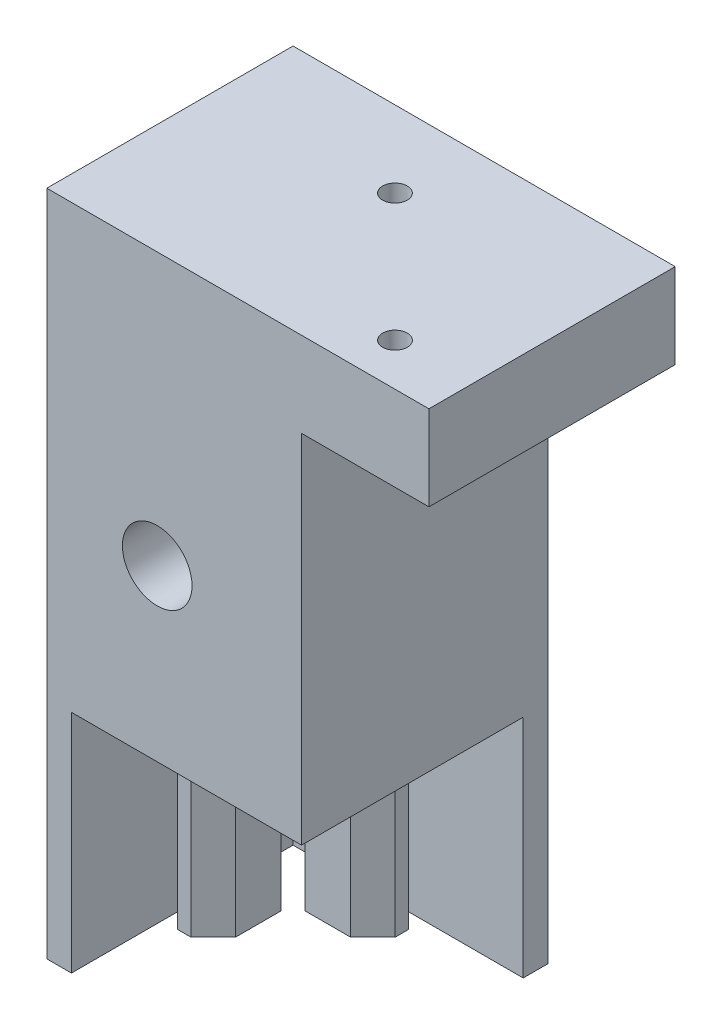
ISO-10303-21;
HEADER;
FILE_DESCRIPTION(('STEP AP214'),'2;1');
FILE_NAME('part.step','',(''),(''),'','','');
FILE_SCHEMA(('AUTOMOTIVE_DESIGN { 1 0 10303 214 1 1 1 1 }'));
ENDSEC;
DATA;
#1=APPLICATION_CONTEXT('core data for automotive mechanical design processes');
#2=APPLICATION_PROTOCOL_DEFINITION('international standard','automotive_design',2000,#1);
#3=PRODUCT_CONTEXT('',#1,'mechanical');
#4=PRODUCT('Part','Part','',(#3));
#5=PRODUCT_RELATED_PRODUCT_CATEGORY('part','',(#4));
#6=PRODUCT_DEFINITION_FORMATION('','',#4);
#7=PRODUCT_DEFINITION_CONTEXT('part definition',#1,'design');
#8=PRODUCT_DEFINITION('design','',#6,#7);
#9=PRODUCT_DEFINITION_SHAPE('','',#8);
#10=(LENGTH_UNIT() NAMED_UNIT(*) SI_UNIT(.MILLI.,.METRE.));
#11=(NAMED_UNIT(*) PLANE_ANGLE_UNIT() SI_UNIT($,.RADIAN.));
#12=(NAMED_UNIT(*) SI_UNIT($,.STERADIAN.) SOLID_ANGLE_UNIT());
#13=UNCERTAINTY_MEASURE_WITH_UNIT(LENGTH_MEASURE(1.E-05),#10,'distance_accuracy_value','');
#14=(GEOMETRIC_REPRESENTATION_CONTEXT(3) GLOBAL_UNCERTAINTY_ASSIGNED_CONTEXT((#13)) GLOBAL_UNIT_ASSIGNED_CONTEXT((#10,
#11,#12)) REPRESENTATION_CONTEXT('',''));
#15=CARTESIAN_POINT('',(0.,0.,0.));
#16=DIRECTION('',(0.,0.,1.));
#17=DIRECTION('',(1.,0.,0.));
#18=AXIS2_PLACEMENT_3D('',#15,#16,#17);
#19=CARTESIAN_POINT('',(0.,0.,6.));
#20=DIRECTION('',(0.,0.,1.));
#21=DIRECTION('',(1.,0.,0.));
#22=AXIS2_PLACEMENT_3D('',#19,#20,#21);
#23=PLANE('',#22);
#24=CARTESIAN_POINT('',(13.,40.,6.));
#25=DIRECTION('',(0.,0.,1.));
#26=DIRECTION('',(1.,0.,0.));
#27=AXIS2_PLACEMENT_3D('',#24,#25,#26);
#28=CIRCLE('',#27,4.1);
#29=CARTESIAN_POINT('',(17.1,40.,6.));
#30=VERTEX_POINT('',#29);
#31=EDGE_CURVE('E387',#30,#30,#28,.T.);
#32=ORIENTED_EDGE('',*,*,#31,.F.);
#33=EDGE_LOOP('',(#32));
#34=FACE_BOUND('',#33,.T.);
#35=DIRECTION('',(0.,-1.,0.));
#36=VECTOR('',#35,1.);
#37=CARTESIAN_POINT('',(0.,72.,6.));
#38=LINE('',#37,#36);
#39=CARTESIAN_POINT('',(0.,72.,6.));
#40=VERTEX_POINT('',#39);
#41=CARTESIAN_POINT('',(0.,-6.6,6.));
#42=VERTEX_POINT('',#41);
#43=EDGE_CURVE('E395',#40,#42,#38,.T.);
#44=ORIENTED_EDGE('',*,*,#43,.T.);
#45=DIRECTION('',(-1.,0.,0.));
#46=VECTOR('',#45,1.);
#47=CARTESIAN_POINT('',(2.9,-6.6,6.));
#48=LINE('',#47,#46);
#49=CARTESIAN_POINT('',(2.9,-6.6,6.));
#50=VERTEX_POINT('',#49);
#51=EDGE_CURVE('E290',#50,#42,#48,.T.);
#52=ORIENTED_EDGE('',*,*,#51,.F.);
#53=DIRECTION('',(0.,-1.,0.));
#54=VECTOR('',#53,1.);
#55=CARTESIAN_POINT('',(2.9,34.1003546051186,6.));
#56=LINE('',#55,#54);
#57=CARTESIAN_POINT('',(2.9,20.,6.));
#58=VERTEX_POINT('',#57);
#59=EDGE_CURVE('E361',#58,#50,#56,.T.);
#60=ORIENTED_EDGE('',*,*,#59,.F.);
#61=DIRECTION('',(1.,0.,0.));
#62=VECTOR('',#61,1.);
#63=CARTESIAN_POINT('',(3.,20.,6.));
#64=LINE('',#63,#62);
#65=CARTESIAN_POINT('',(30.,20.,6.));
#66=VERTEX_POINT('',#65);
#67=EDGE_CURVE('E397',#58,#66,#64,.T.);
#68=ORIENTED_EDGE('',*,*,#67,.T.);
#69=DIRECTION('',(0.,1.,0.));
#70=VECTOR('',#69,1.);
#71=CARTESIAN_POINT('',(30.,20.,6.));
#72=LINE('',#71,#70);
#73=CARTESIAN_POINT('',(30.,62.,6.));
#74=VERTEX_POINT('',#73);
#75=EDGE_CURVE('E400',#66,#74,#72,.T.);
#76=ORIENTED_EDGE('',*,*,#75,.T.);
#77=DIRECTION('',(1.,0.,0.));
#78=VECTOR('',#77,1.);
#79=CARTESIAN_POINT('',(30.,62.,6.));
#80=LINE('',#79,#78);
#81=CARTESIAN_POINT('',(45.0000000000006,62.,6.));
#82=VERTEX_POINT('',#81);
#83=EDGE_CURVE('E403',#74,#82,#80,.T.);
#84=ORIENTED_EDGE('',*,*,#83,.T.);
#85=DIRECTION('',(0.,1.,0.));
#86=VECTOR('',#85,1.);
#87=CARTESIAN_POINT('',(45.0000000000006,62.,6.));
#88=LINE('',#87,#86);
#89=CARTESIAN_POINT('',(45.0000000000006,72.,6.));
#90=VERTEX_POINT('',#89);
#91=EDGE_CURVE('E406',#82,#90,#88,.T.);
#92=ORIENTED_EDGE('',*,*,#91,.T.);
#93=DIRECTION('',(-1.,0.,0.));
#94=VECTOR('',#93,1.);
#95=CARTESIAN_POINT('',(45.0000000000006,72.,6.));
#96=LINE('',#95,#94);
#97=EDGE_CURVE('E409',#90,#40,#96,.T.);
#98=ORIENTED_EDGE('',*,*,#97,.T.);
#99=EDGE_LOOP('',(#44,#52,#60,#68,#76,#84,#92,#98));
#100=FACE_BOUND('',#99,.T.);
#101=ADVANCED_FACE('F71',(#34,#100),#23,.T.);
#102=CARTESIAN_POINT('',(13.,40.,-6.));
#103=DIRECTION('',(0.,0.,1.));
#104=DIRECTION('',(1.,0.,0.));
#105=AXIS2_PLACEMENT_3D('',#102,#103,#104);
#106=CYLINDRICAL_SURFACE('',#105,4.1);
#107=CARTESIAN_POINT('',(13.,40.,-6.));
#108=DIRECTION('',(0.,0.,1.));
#109=DIRECTION('',(1.,0.,0.));
#110=AXIS2_PLACEMENT_3D('',#107,#108,#109);
#111=CIRCLE('',#110,4.1);
#112=CARTESIAN_POINT('',(17.1,40.,-6.));
#113=VERTEX_POINT('',#112);
#114=EDGE_CURVE('E502',#113,#113,#111,.T.);
#115=ORIENTED_EDGE('',*,*,#114,.F.);
#116=EDGE_LOOP('',(#115));
#117=FACE_BOUND('',#116,.T.);
#118=ORIENTED_EDGE('',*,*,#31,.T.);
#119=EDGE_LOOP('',(#118));
#120=FACE_BOUND('',#119,.T.);
#121=ADVANCED_FACE('F623',(#117,#120),#106,.F.);
#122=CARTESIAN_POINT('',(13.,40.,-6.));
#123=DIRECTION('',(0.,0.,1.));
#124=DIRECTION('',(1.,0.,0.));
#125=AXIS2_PLACEMENT_3D('',#122,#123,#124);
#126=PLANE('',#125);
#127=ORIENTED_EDGE('',*,*,#114,.T.);
#128=EDGE_LOOP('',(#127));
#129=FACE_BOUND('',#128,.T.);
#130=ADVANCED_FACE('F629',(#129),#126,.T.);
#131=CARTESIAN_POINT('',(23.,-12.1313643090702,-15.2999999996485));
#132=DIRECTION('',(0.,0.,-1.));
#133=DIRECTION('',(-1.,0.,0.));
#134=AXIS2_PLACEMENT_3D('',#131,#132,#133);
#135=PLANE('',#134);
#136=DIRECTION('',(0.,1.,0.));
#137=VECTOR('',#136,1.);
#138=CARTESIAN_POINT('',(6.26715728747304,-12.1313643090702,-15.2999999996485));
#139=LINE('',#138,#137);
#140=CARTESIAN_POINT('',(6.26715728747304,-6.6,-15.2999999996485));
#141=VERTEX_POINT('',#140);
#142=CARTESIAN_POINT('',(6.26715728747304,20.,-15.2999999996485));
#143=VERTEX_POINT('',#142);
#144=EDGE_CURVE('E437',#141,#143,#139,.T.);
#145=ORIENTED_EDGE('',*,*,#144,.F.);
#146=DIRECTION('',(1.,0.,0.));
#147=VECTOR('',#146,1.);
#148=CARTESIAN_POINT('',(4.69999999994772,-6.6,-15.2999999996485));
#149=LINE('',#148,#147);
#150=CARTESIAN_POINT('',(4.69999999994772,-6.6,-15.2999999996485));
#151=VERTEX_POINT('',#150);
#152=EDGE_CURVE('E344',#151,#141,#149,.T.);
#153=ORIENTED_EDGE('',*,*,#152,.F.);
#154=DIRECTION('',(0.,1.,0.));
#155=VECTOR('',#154,1.);
#156=CARTESIAN_POINT('',(4.69999999994772,-12.1313643090702,-15.2999999996485));
#157=LINE('',#156,#155);
#158=CARTESIAN_POINT('',(4.69999999994772,20.,-15.2999999996485));
#159=VERTEX_POINT('',#158);
#160=EDGE_CURVE('E434',#151,#159,#157,.T.);
#161=ORIENTED_EDGE('',*,*,#160,.T.);
#162=DIRECTION('',(-1.,0.,0.));
#163=VECTOR('',#162,1.);
#164=CARTESIAN_POINT('',(23.,20.,-15.2999999996485));
#165=LINE('',#164,#163);
#166=EDGE_CURVE('E270',#143,#159,#165,.T.);
#167=ORIENTED_EDGE('',*,*,#166,.F.);
#168=EDGE_LOOP('',(#145,#153,#161,#167));
#169=FACE_BOUND('',#168,.T.);
#170=ADVANCED_FACE('F598',(#169),#135,.T.);
#171=CARTESIAN_POINT('',(10.7835786435609,-12.1313643090702,-10.7835786435608));
#172=DIRECTION('',(0.707106781186544,0.,-0.707106781186551));
#173=DIRECTION('',(-0.707106781186551,0.,-0.707106781186544));
#174=AXIS2_PLACEMENT_3D('',#171,#172,#173);
#175=PLANE('',#174);
#176=DIRECTION('',(0.,1.,0.));
#177=VECTOR('',#176,1.);
#178=CARTESIAN_POINT('',(8.8999999999477,-12.1313643090702,-12.6671572871739));
#179=LINE('',#178,#177);
#180=CARTESIAN_POINT('',(8.8999999999477,-6.6,-12.6671572871739));
#181=VERTEX_POINT('',#180);
#182=CARTESIAN_POINT('',(8.8999999999477,20.,-12.6671572871739));
#183=VERTEX_POINT('',#182);
#184=EDGE_CURVE('E439',#181,#183,#179,.T.);
#185=ORIENTED_EDGE('',*,*,#184,.F.);
#186=DIRECTION('',(0.70710678118655,0.,0.707106781186545));
#187=VECTOR('',#186,1.);
#188=CARTESIAN_POINT('',(6.26715728747304,-6.6,-15.2999999996485));
#189=LINE('',#188,#187);
#190=EDGE_CURVE('E347',#141,#181,#189,.T.);
#191=ORIENTED_EDGE('',*,*,#190,.F.);
#192=ORIENTED_EDGE('',*,*,#144,.T.);
#193=DIRECTION('',(-0.707106781186551,0.,-0.707106781186544));
#194=VECTOR('',#193,1.);
#195=CARTESIAN_POINT('',(10.7835786435609,20.,-10.7835786435608));
#196=LINE('',#195,#194);
#197=EDGE_CURVE('E427',#183,#143,#196,.T.);
#198=ORIENTED_EDGE('',*,*,#197,.F.);
#199=EDGE_LOOP('',(#185,#191,#192,#198));
#200=FACE_BOUND('',#199,.T.);
#201=ADVANCED_FACE('F602',(#200),#175,.T.);
#202=CARTESIAN_POINT('',(8.8999999999477,-12.1313643090702,-23.));
#203=DIRECTION('',(1.,0.,0.));
#204=DIRECTION('',(0.,0.,-1.));
#205=AXIS2_PLACEMENT_3D('',#202,#203,#204);
#206=PLANE('',#205);
#207=DIRECTION('',(0.,1.,0.));
#208=VECTOR('',#207,1.);
#209=CARTESIAN_POINT('',(8.8999999999477,-12.1313643090702,-7.33284271212317));
#210=LINE('',#209,#208);
#211=CARTESIAN_POINT('',(8.8999999999477,-6.6,-7.33284271212316));
#212=VERTEX_POINT('',#211);
#213=CARTESIAN_POINT('',(8.8999999999477,20.,-7.33284271212317));
#214=VERTEX_POINT('',#213);
#215=EDGE_CURVE('E441',#212,#214,#210,.T.);
#216=ORIENTED_EDGE('',*,*,#215,.F.);
#217=DIRECTION('',(0.,0.,1.));
#218=VECTOR('',#217,1.);
#219=CARTESIAN_POINT('',(8.8999999999477,-6.6,-12.6671572871739));
#220=LINE('',#219,#218);
#221=EDGE_CURVE('E350',#181,#212,#220,.T.);
#222=ORIENTED_EDGE('',*,*,#221,.F.);
#223=ORIENTED_EDGE('',*,*,#184,.T.);
#224=DIRECTION('',(0.,0.,-1.));
#225=VECTOR('',#224,1.);
#226=CARTESIAN_POINT('',(8.8999999999477,20.,-23.));
#227=LINE('',#226,#225);
#228=EDGE_CURVE('E424',#214,#183,#227,.T.);
#229=ORIENTED_EDGE('',*,*,#228,.F.);
#230=EDGE_LOOP('',(#216,#222,#223,#229));
#231=FACE_BOUND('',#230,.T.);
#232=ADVANCED_FACE('F606',(#231),#206,.T.);
#233=CARTESIAN_POINT('',(23.7835786439122,-12.1313643090702,-22.2164213560878));
#234=DIRECTION('',(0.707106781186551,0.,0.707106781186544));
#235=DIRECTION('',(0.707106781186544,0.,-0.707106781186551));
#236=AXIS2_PLACEMENT_3D('',#233,#234,#235);
#237=PLANE('',#236);
#238=DIRECTION('',(0.,1.,0.));
#239=VECTOR('',#238,1.);
#240=CARTESIAN_POINT('',(6.26715728747308,-12.1313643090702,-4.69999999964852));
#241=LINE('',#240,#239);
#242=CARTESIAN_POINT('',(6.26715728747308,-6.6,-4.69999999964852));
#243=VERTEX_POINT('',#242);
#244=CARTESIAN_POINT('',(6.26715728747308,20.,-4.69999999964852));
#245=VERTEX_POINT('',#244);
#246=EDGE_CURVE('E443',#243,#245,#241,.T.);
#247=ORIENTED_EDGE('',*,*,#246,.F.);
#248=DIRECTION('',(-0.707106781186545,0.,0.70710678118655));
#249=VECTOR('',#248,1.);
#250=CARTESIAN_POINT('',(8.8999999999477,-6.6,-7.33284271212316));
#251=LINE('',#250,#249);
#252=EDGE_CURVE('E353',#212,#243,#251,.T.);
#253=ORIENTED_EDGE('',*,*,#252,.F.);
#254=ORIENTED_EDGE('',*,*,#215,.T.);
#255=DIRECTION('',(0.707106781186545,0.,-0.707106781186551));
#256=VECTOR('',#255,1.);
#257=CARTESIAN_POINT('',(23.7835786439122,20.,-22.2164213560878));
#258=LINE('',#257,#256);
#259=EDGE_CURVE('E421',#245,#214,#258,.T.);
#260=ORIENTED_EDGE('',*,*,#259,.F.);
#261=EDGE_LOOP('',(#247,#253,#254,#260));
#262=FACE_BOUND('',#261,.T.);
#263=ADVANCED_FACE('F609',(#262),#237,.T.);
#264=CARTESIAN_POINT('',(23.,-12.1313643090702,-4.69999999964853));
#265=DIRECTION('',(0.,0.,1.));
#266=DIRECTION('',(1.,0.,0.));
#267=AXIS2_PLACEMENT_3D('',#264,#265,#266);
#268=PLANE('',#267);
#269=DIRECTION('',(0.,1.,0.));
#270=VECTOR('',#269,1.);
#271=CARTESIAN_POINT('',(4.69999999994772,-12.1313643090702,-4.69999999964852));
#272=LINE('',#271,#270);
#273=CARTESIAN_POINT('',(4.69999999994772,-6.6,-4.69999999964852));
#274=VERTEX_POINT('',#273);
#275=CARTESIAN_POINT('',(4.69999999994772,20.,-4.69999999964852));
#276=VERTEX_POINT('',#275);
#277=EDGE_CURVE('E269',#274,#276,#272,.T.);
#278=ORIENTED_EDGE('',*,*,#277,.F.);
#279=DIRECTION('',(-1.,0.,0.));
#280=VECTOR('',#279,1.);
#281=CARTESIAN_POINT('',(6.26715728747308,-6.6,-4.69999999964852));
#282=LINE('',#281,#280);
#283=EDGE_CURVE('E286',#243,#274,#282,.T.);
#284=ORIENTED_EDGE('',*,*,#283,.F.);
#285=ORIENTED_EDGE('',*,*,#246,.T.);
#286=DIRECTION('',(1.,0.,0.));
#287=VECTOR('',#286,1.);
#288=CARTESIAN_POINT('',(23.,20.,-4.69999999964853));
#289=LINE('',#288,#287);
#290=EDGE_CURVE('E418',#276,#245,#289,.T.);
#291=ORIENTED_EDGE('',*,*,#290,.F.);
#292=EDGE_LOOP('',(#278,#284,#285,#291));
#293=FACE_BOUND('',#292,.T.);
#294=ADVANCED_FACE('F613',(#293),#268,.T.);
#295=CARTESIAN_POINT('',(4.69999999994772,-12.1313643090702,-23.));
#296=DIRECTION('',(-1.,0.,0.));
#297=DIRECTION('',(0.,0.,1.));
#298=AXIS2_PLACEMENT_3D('',#295,#296,#297);
#299=PLANE('',#298);
#300=DIRECTION('',(0.,1.,0.));
#301=VECTOR('',#300,1.);
#302=CARTESIAN_POINT('',(4.69999999994772,-12.1313643090702,-7.09999999964851));
#303=LINE('',#302,#301);
#304=CARTESIAN_POINT('',(4.69999999994772,-6.6,-7.09999999964851));
#305=VERTEX_POINT('',#304);
#306=CARTESIAN_POINT('',(4.69999999994772,20.,-7.09999999964851));
#307=VERTEX_POINT('',#306);
#308=EDGE_CURVE('E260',#305,#307,#303,.T.);
#309=ORIENTED_EDGE('',*,*,#308,.F.);
#310=DIRECTION('',(0.,0.,-1.));
#311=VECTOR('',#310,1.);
#312=CARTESIAN_POINT('',(4.69999999994772,-6.6,-4.69999999964852));
#313=LINE('',#312,#311);
#314=EDGE_CURVE('E264',#274,#305,#313,.T.);
#315=ORIENTED_EDGE('',*,*,#314,.F.);
#316=ORIENTED_EDGE('',*,*,#277,.T.);
#317=DIRECTION('',(0.,0.,1.));
#318=VECTOR('',#317,1.);
#319=CARTESIAN_POINT('',(4.69999999994772,20.,-23.));
#320=LINE('',#319,#318);
#321=EDGE_CURVE('E266',#307,#276,#320,.T.);
#322=ORIENTED_EDGE('',*,*,#321,.F.);
#323=EDGE_LOOP('',(#309,#315,#316,#322));
#324=FACE_BOUND('',#323,.T.);
#325=ADVANCED_FACE('F262',(#324),#299,.T.);
#326=CARTESIAN_POINT('',(23.,-12.1313643090702,-7.09999999964852));
#327=DIRECTION('',(0.,0.,1.));
#328=DIRECTION('',(1.,0.,0.));
#329=AXIS2_PLACEMENT_3D('',#326,#327,#328);
#330=PLANE('',#329);
#331=DIRECTION('',(1.,0.,0.));
#332=VECTOR('',#331,1.);
#333=CARTESIAN_POINT('',(23.,20.,-7.09999999964852));
#334=LINE('',#333,#332);
#335=CARTESIAN_POINT('',(2.9,20.,-7.09999999957954));
#336=VERTEX_POINT('',#335);
#337=EDGE_CURVE('E415',#336,#307,#334,.T.);
#338=ORIENTED_EDGE('',*,*,#337,.F.);
#339=DIRECTION('',(0.,-1.,0.));
#340=VECTOR('',#339,1.);
#341=CARTESIAN_POINT('',(2.9,34.1003546051186,-7.09999999957954));
#342=LINE('',#341,#340);
#343=CARTESIAN_POINT('',(2.9,-6.6,-7.09999999957954));
#344=VERTEX_POINT('',#343);
#345=EDGE_CURVE('E276',#336,#344,#342,.T.);
#346=ORIENTED_EDGE('',*,*,#345,.T.);
#347=DIRECTION('',(-1.,0.,3.83195597178084E-11));
#348=VECTOR('',#347,1.);
#349=CARTESIAN_POINT('',(4.69999999994772,-6.6,-7.09999999964851));
#350=LINE('',#349,#348);
#351=EDGE_CURVE('E273',#305,#344,#350,.T.);
#352=ORIENTED_EDGE('',*,*,#351,.F.);
#353=ORIENTED_EDGE('',*,*,#308,.T.);
#354=EDGE_LOOP('',(#338,#346,#352,#353));
#355=FACE_BOUND('',#354,.T.);
#356=ADVANCED_FACE('F274',(#355),#330,.T.);
#357=CARTESIAN_POINT('',(15.9000000003515,-12.1313643090702,0.));
#358=DIRECTION('',(-1.,0.,0.));
#359=DIRECTION('',(0.,0.,1.));
#360=AXIS2_PLACEMENT_3D('',#357,#358,#359);
#361=PLANE('',#360);
#362=DIRECTION('',(0.,1.,0.));
#363=VECTOR('',#362,1.);
#364=CARTESIAN_POINT('',(15.9000000003515,-12.1313643090702,-18.3000000000523));
#365=LINE('',#364,#363);
#366=CARTESIAN_POINT('',(15.9000000003515,-6.6,-18.3000000000523));
#367=VERTEX_POINT('',#366);
#368=CARTESIAN_POINT('',(15.9000000003515,20.,-18.3000000000523));
#369=VERTEX_POINT('',#368);
#370=EDGE_CURVE('E470',#367,#369,#365,.T.);
#371=ORIENTED_EDGE('',*,*,#370,.F.);
#372=DIRECTION('',(-3.83181141149118E-11,0.,1.));
#373=VECTOR('',#372,1.);
#374=CARTESIAN_POINT('',(15.9000000004205,-6.6,-20.1));
#375=LINE('',#374,#373);
#376=CARTESIAN_POINT('',(15.9000000004205,-6.6,-20.1));
#377=VERTEX_POINT('',#376);
#378=EDGE_CURVE('E305',#377,#367,#375,.T.);
#379=ORIENTED_EDGE('',*,*,#378,.F.);
#380=DIRECTION('',(0.,-1.,0.));
#381=VECTOR('',#380,1.);
#382=CARTESIAN_POINT('',(15.9000000004205,34.1003546051186,-20.1));
#383=LINE('',#382,#381);
#384=CARTESIAN_POINT('',(15.9000000004205,20.,-20.1));
#385=VERTEX_POINT('',#384);
#386=EDGE_CURVE('E365',#385,#377,#383,.T.);
#387=ORIENTED_EDGE('',*,*,#386,.F.);
#388=DIRECTION('',(0.,0.,1.));
#389=VECTOR('',#388,1.);
#390=CARTESIAN_POINT('',(15.9000000003515,20.,0.));
#391=LINE('',#390,#389);
#392=EDGE_CURVE('E471',#385,#369,#391,.T.);
#393=ORIENTED_EDGE('',*,*,#392,.T.);
#394=EDGE_LOOP('',(#371,#379,#387,#393));
#395=FACE_BOUND('',#394,.T.);
#396=ADVANCED_FACE('F553',(#395),#361,.F.);
#397=CARTESIAN_POINT('',(0.,-12.1313643090702,-18.3000000000523));
#398=DIRECTION('',(0.,0.,1.));
#399=DIRECTION('',(1.,0.,0.));
#400=AXIS2_PLACEMENT_3D('',#397,#398,#399);
#401=PLANE('',#400);
#402=DIRECTION('',(0.,1.,0.));
#403=VECTOR('',#402,1.);
#404=CARTESIAN_POINT('',(18.3000000003515,-12.1313643090702,-18.3000000000523));
#405=LINE('',#404,#403);
#406=CARTESIAN_POINT('',(18.3000000003515,-6.6,-18.3000000000523));
#407=VERTEX_POINT('',#406);
#408=CARTESIAN_POINT('',(18.3000000003515,20.,-18.3000000000523));
#409=VERTEX_POINT('',#408);
#410=EDGE_CURVE('E468',#407,#409,#405,.T.);
#411=ORIENTED_EDGE('',*,*,#410,.F.);
#412=DIRECTION('',(1.,0.,0.));
#413=VECTOR('',#412,1.);
#414=CARTESIAN_POINT('',(15.9000000003515,-6.6,-18.3000000000523));
#415=LINE('',#414,#413);
#416=EDGE_CURVE('E308',#367,#407,#415,.T.);
#417=ORIENTED_EDGE('',*,*,#416,.F.);
#418=ORIENTED_EDGE('',*,*,#370,.T.);
#419=DIRECTION('',(1.,0.,0.));
#420=VECTOR('',#419,1.);
#421=CARTESIAN_POINT('',(0.,20.,-18.3000000000523));
#422=LINE('',#421,#420);
#423=EDGE_CURVE('E93',#369,#409,#422,.T.);
#424=ORIENTED_EDGE('',*,*,#423,.T.);
#425=EDGE_LOOP('',(#411,#417,#418,#424));
#426=FACE_BOUND('',#425,.T.);
#427=ADVANCED_FACE('F555',(#426),#401,.F.);
#428=CARTESIAN_POINT('',(18.3000000003515,-12.1313643090702,0.));
#429=DIRECTION('',(-1.,0.,0.));
#430=DIRECTION('',(0.,0.,1.));
#431=AXIS2_PLACEMENT_3D('',#428,#429,#430);
#432=PLANE('',#431);
#433=DIRECTION('',(0.,1.,0.));
#434=VECTOR('',#433,1.);
#435=CARTESIAN_POINT('',(18.3000000003515,-12.1313643090702,-16.7328427125269));
#436=LINE('',#435,#434);
#437=CARTESIAN_POINT('',(18.3000000003515,-6.6,-16.7328427125269));
#438=VERTEX_POINT('',#437);
#439=CARTESIAN_POINT('',(18.3000000003515,20.,-16.7328427125269));
#440=VERTEX_POINT('',#439);
#441=EDGE_CURVE('E464',#438,#440,#436,.T.);
#442=ORIENTED_EDGE('',*,*,#441,.F.);
#443=DIRECTION('',(0.,0.,1.));
#444=VECTOR('',#443,1.);
#445=CARTESIAN_POINT('',(18.3000000003515,-6.6,-18.3000000000523));
#446=LINE('',#445,#444);
#447=EDGE_CURVE('E311',#407,#438,#446,.T.);
#448=ORIENTED_EDGE('',*,*,#447,.F.);
#449=ORIENTED_EDGE('',*,*,#410,.T.);
#450=DIRECTION('',(0.,0.,1.));
#451=VECTOR('',#450,1.);
#452=CARTESIAN_POINT('',(18.3000000003515,20.,0.));
#453=LINE('',#452,#451);
#454=EDGE_CURVE('E465',#409,#440,#453,.T.);
#455=ORIENTED_EDGE('',*,*,#454,.T.);
#456=EDGE_LOOP('',(#442,#448,#449,#455));
#457=FACE_BOUND('',#456,.T.);
#458=ADVANCED_FACE('F559',(#457),#432,.F.);
#459=CARTESIAN_POINT('',(0.783578643912206,-12.1313643090702,0.783578643912212));
#460=DIRECTION('',(-0.707106781186545,0.,-0.70710678118655));
#461=DIRECTION('',(-0.70710678118655,0.,0.707106781186545));
#462=AXIS2_PLACEMENT_3D('',#459,#460,#461);
#463=PLANE('',#462);
#464=DIRECTION('',(0.,1.,0.));
#465=VECTOR('',#464,1.);
#466=CARTESIAN_POINT('',(15.6671572878768,-12.1313643090702,-14.1000000000523));
#467=LINE('',#466,#465);
#468=CARTESIAN_POINT('',(15.6671572878768,-6.6,-14.1000000000523));
#469=VERTEX_POINT('',#468);
#470=CARTESIAN_POINT('',(15.6671572878768,20.,-14.1000000000523));
#471=VERTEX_POINT('',#470);
#472=EDGE_CURVE('E460',#469,#471,#467,.T.);
#473=ORIENTED_EDGE('',*,*,#472,.F.);
#474=DIRECTION('',(-0.70710678118655,0.,0.707106781186545));
#475=VECTOR('',#474,1.);
#476=CARTESIAN_POINT('',(18.3000000003515,-6.6,-16.7328427125269));
#477=LINE('',#476,#475);
#478=EDGE_CURVE('E314',#438,#469,#477,.T.);
#479=ORIENTED_EDGE('',*,*,#478,.F.);
#480=ORIENTED_EDGE('',*,*,#441,.T.);
#481=DIRECTION('',(-0.70710678118655,0.,0.707106781186545));
#482=VECTOR('',#481,1.);
#483=CARTESIAN_POINT('',(0.783578643912206,20.,0.783578643912212));
#484=LINE('',#483,#482);
#485=EDGE_CURVE('E461',#440,#471,#484,.T.);
#486=ORIENTED_EDGE('',*,*,#485,.T.);
#487=EDGE_LOOP('',(#473,#479,#480,#486));
#488=FACE_BOUND('',#487,.T.);
#489=ADVANCED_FACE('F561',(#488),#463,.F.);
#490=CARTESIAN_POINT('',(0.,-12.1313643090702,-14.1000000000523));
#491=DIRECTION('',(0.,0.,-1.));
#492=DIRECTION('',(-1.,0.,0.));
#493=AXIS2_PLACEMENT_3D('',#490,#491,#492);
#494=PLANE('',#493);
#495=DIRECTION('',(0.,1.,0.));
#496=VECTOR('',#495,1.);
#497=CARTESIAN_POINT('',(10.3328427128261,-12.1313643090702,-14.1000000000523));
#498=LINE('',#497,#496);
#499=CARTESIAN_POINT('',(10.3328427128261,-6.6,-14.1000000000523));
#500=VERTEX_POINT('',#499);
#501=CARTESIAN_POINT('',(10.3328427128261,20.,-14.1000000000523));
#502=VERTEX_POINT('',#501);
#503=EDGE_CURVE('E456',#500,#502,#498,.T.);
#504=ORIENTED_EDGE('',*,*,#503,.F.);
#505=DIRECTION('',(-1.,0.,0.));
#506=VECTOR('',#505,1.);
#507=CARTESIAN_POINT('',(15.6671572878768,-6.6,-14.1000000000523));
#508=LINE('',#507,#506);
#509=EDGE_CURVE('E317',#469,#500,#508,.T.);
#510=ORIENTED_EDGE('',*,*,#509,.F.);
#511=ORIENTED_EDGE('',*,*,#472,.T.);
#512=DIRECTION('',(-1.,0.,0.));
#513=VECTOR('',#512,1.);
#514=CARTESIAN_POINT('',(0.,20.,-14.1000000000523));
#515=LINE('',#514,#513);
#516=EDGE_CURVE('E457',#471,#502,#515,.T.);
#517=ORIENTED_EDGE('',*,*,#516,.T.);
#518=EDGE_LOOP('',(#504,#510,#511,#517));
#519=FACE_BOUND('',#518,.T.);
#520=ADVANCED_FACE('F565',(#519),#494,.F.);
#521=CARTESIAN_POINT('',(12.2164213564392,-12.1313643090702,-12.2164213564391));
#522=DIRECTION('',(0.70710678118655,0.,-0.707106781186545));
#523=DIRECTION('',(-0.707106781186545,0.,-0.70710678118655));
#524=AXIS2_PLACEMENT_3D('',#521,#522,#523);
#525=PLANE('',#524);
#526=DIRECTION('',(0.,1.,0.));
#527=VECTOR('',#526,1.);
#528=CARTESIAN_POINT('',(7.70000000035147,-12.1313643090702,-16.732842712527));
#529=LINE('',#528,#527);
#530=CARTESIAN_POINT('',(7.70000000035147,-6.6,-16.732842712527));
#531=VERTEX_POINT('',#530);
#532=CARTESIAN_POINT('',(7.70000000035147,20.,-16.732842712527));
#533=VERTEX_POINT('',#532);
#534=EDGE_CURVE('E452',#531,#533,#529,.T.);
#535=ORIENTED_EDGE('',*,*,#534,.F.);
#536=DIRECTION('',(-0.707106781186545,0.,-0.70710678118655));
#537=VECTOR('',#536,1.);
#538=CARTESIAN_POINT('',(10.3328427128261,-6.6,-14.1000000000523));
#539=LINE('',#538,#537);
#540=EDGE_CURVE('E320',#500,#531,#539,.T.);
#541=ORIENTED_EDGE('',*,*,#540,.F.);
#542=ORIENTED_EDGE('',*,*,#503,.T.);
#543=DIRECTION('',(-0.707106781186545,0.,-0.70710678118655));
#544=VECTOR('',#543,1.);
#545=CARTESIAN_POINT('',(12.2164213564392,20.,-12.2164213564391));
#546=LINE('',#545,#544);
#547=EDGE_CURVE('E453',#502,#533,#546,.T.);
#548=ORIENTED_EDGE('',*,*,#547,.T.);
#549=EDGE_LOOP('',(#535,#541,#542,#548));
#550=FACE_BOUND('',#549,.T.);
#551=ADVANCED_FACE('F567',(#550),#525,.F.);
#552=CARTESIAN_POINT('',(7.70000000035147,-12.1313643090702,0.));
#553=DIRECTION('',(1.,0.,0.));
#554=DIRECTION('',(0.,0.,-1.));
#555=AXIS2_PLACEMENT_3D('',#552,#553,#554);
#556=PLANE('',#555);
#557=DIRECTION('',(0.,1.,0.));
#558=VECTOR('',#557,1.);
#559=CARTESIAN_POINT('',(7.70000000035147,-12.1313643090702,-18.3000000000523));
#560=LINE('',#559,#558);
#561=CARTESIAN_POINT('',(7.70000000035147,-6.6,-18.3000000000523));
#562=VERTEX_POINT('',#561);
#563=CARTESIAN_POINT('',(7.70000000035147,20.,-18.3000000000523));
#564=VERTEX_POINT('',#563);
#565=EDGE_CURVE('E447',#562,#564,#560,.T.);
#566=ORIENTED_EDGE('',*,*,#565,.F.);
#567=DIRECTION('',(0.,0.,-1.));
#568=VECTOR('',#567,1.);
#569=CARTESIAN_POINT('',(7.70000000035147,-6.6,-16.732842712527));
#570=LINE('',#569,#568);
#571=EDGE_CURVE('E323',#531,#562,#570,.T.);
#572=ORIENTED_EDGE('',*,*,#571,.F.);
#573=ORIENTED_EDGE('',*,*,#534,.T.);
#574=DIRECTION('',(0.,0.,-1.));
#575=VECTOR('',#574,1.);
#576=CARTESIAN_POINT('',(7.70000000035147,20.,0.));
#577=LINE('',#576,#575);
#578=EDGE_CURVE('E448',#533,#564,#577,.T.);
#579=ORIENTED_EDGE('',*,*,#578,.T.);
#580=EDGE_LOOP('',(#566,#572,#573,#579));
#581=FACE_BOUND('',#580,.T.);
#582=ADVANCED_FACE('F571',(#581),#556,.F.);
#583=CARTESIAN_POINT('',(0.,-12.1313643090702,-18.3000000000523));
#584=DIRECTION('',(0.,0.,1.));
#585=DIRECTION('',(1.,0.,0.));
#586=AXIS2_PLACEMENT_3D('',#583,#584,#585);
#587=PLANE('',#586);
#588=DIRECTION('',(0.,1.,0.));
#589=VECTOR('',#588,1.);
#590=CARTESIAN_POINT('',(10.1000000003515,-12.1313643090702,-18.3000000000523));
#591=LINE('',#590,#589);
#592=CARTESIAN_POINT('',(10.1000000003515,-6.6,-18.3000000000523));
#593=VERTEX_POINT('',#592);
#594=CARTESIAN_POINT('',(10.1000000003515,20.,-18.3000000000523));
#595=VERTEX_POINT('',#594);
#596=EDGE_CURVE('E475',#593,#595,#591,.T.);
#597=ORIENTED_EDGE('',*,*,#596,.F.);
#598=DIRECTION('',(1.,0.,0.));
#599=VECTOR('',#598,1.);
#600=CARTESIAN_POINT('',(7.70000000035147,-6.6,-18.3000000000523));
#601=LINE('',#600,#599);
#602=EDGE_CURVE('E326',#562,#593,#601,.T.);
#603=ORIENTED_EDGE('',*,*,#602,.F.);
#604=ORIENTED_EDGE('',*,*,#565,.T.);
#605=DIRECTION('',(1.,0.,0.));
#606=VECTOR('',#605,1.);
#607=CARTESIAN_POINT('',(0.,20.,-18.3000000000523));
#608=LINE('',#607,#606);
#609=EDGE_CURVE('E476',#564,#595,#608,.T.);
#610=ORIENTED_EDGE('',*,*,#609,.T.);
#611=EDGE_LOOP('',(#597,#603,#604,#610));
#612=FACE_BOUND('',#611,.T.);
#613=ADVANCED_FACE('F573',(#612),#587,.F.);
#614=CARTESIAN_POINT('',(10.1000000003515,-12.1313643090702,0.));
#615=DIRECTION('',(1.,0.,0.));
#616=DIRECTION('',(0.,0.,-1.));
#617=AXIS2_PLACEMENT_3D('',#614,#615,#616);
#618=PLANE('',#617);
#619=DIRECTION('',(0.,-1.,0.));
#620=VECTOR('',#619,1.);
#621=CARTESIAN_POINT('',(10.1000000003515,34.1003546051186,-20.1));
#622=LINE('',#621,#620);
#623=CARTESIAN_POINT('',(10.1000000003515,20.,-20.1));
#624=VERTEX_POINT('',#623);
#625=CARTESIAN_POINT('',(10.1000000003515,-6.6,-20.1));
#626=VERTEX_POINT('',#625);
#627=EDGE_CURVE('E369',#624,#626,#622,.T.);
#628=ORIENTED_EDGE('',*,*,#627,.T.);
#629=DIRECTION('',(0.,0.,-1.));
#630=VECTOR('',#629,1.);
#631=CARTESIAN_POINT('',(10.1000000003515,-6.6,-18.3000000000523));
#632=LINE('',#631,#630);
#633=EDGE_CURVE('E329',#593,#626,#632,.T.);
#634=ORIENTED_EDGE('',*,*,#633,.F.);
#635=ORIENTED_EDGE('',*,*,#596,.T.);
#636=DIRECTION('',(0.,0.,-1.));
#637=VECTOR('',#636,1.);
#638=CARTESIAN_POINT('',(10.1000000003515,20.,0.));
#639=LINE('',#638,#637);
#640=EDGE_CURVE('E86',#595,#624,#639,.T.);
#641=ORIENTED_EDGE('',*,*,#640,.T.);
#642=EDGE_LOOP('',(#628,#634,#635,#641));
#643=FACE_BOUND('',#642,.T.);
#644=ADVANCED_FACE('F577',(#643),#618,.F.);
#645=CARTESIAN_POINT('',(23.,-12.1313643090702,-12.8999999996485));
#646=DIRECTION('',(0.,0.,-1.));
#647=DIRECTION('',(-1.,0.,0.));
#648=AXIS2_PLACEMENT_3D('',#645,#646,#647);
#649=PLANE('',#648);
#650=DIRECTION('',(0.,1.,0.));
#651=VECTOR('',#650,1.);
#652=CARTESIAN_POINT('',(4.69999999994772,-12.1313643090702,-12.8999999996485));
#653=LINE('',#652,#651);
#654=CARTESIAN_POINT('',(4.69999999994772,-6.6,-12.8999999996485));
#655=VERTEX_POINT('',#654);
#656=CARTESIAN_POINT('',(4.69999999994772,20.,-12.8999999996485));
#657=VERTEX_POINT('',#656);
#658=EDGE_CURVE('E436',#655,#657,#653,.T.);
#659=ORIENTED_EDGE('',*,*,#658,.F.);
#660=DIRECTION('',(1.,0.,0.));
#661=VECTOR('',#660,1.);
#662=CARTESIAN_POINT('',(2.9,-6.6,-12.8999999996485));
#663=LINE('',#662,#661);
#664=CARTESIAN_POINT('',(2.9,-6.6,-12.8999999996485));
#665=VERTEX_POINT('',#664);
#666=EDGE_CURVE('E338',#665,#655,#663,.T.);
#667=ORIENTED_EDGE('',*,*,#666,.F.);
#668=DIRECTION('',(0.,-1.,0.));
#669=VECTOR('',#668,1.);
#670=CARTESIAN_POINT('',(2.9,34.1003546051186,-12.8999999996485));
#671=LINE('',#670,#669);
#672=CARTESIAN_POINT('',(2.9,20.,-12.8999999996485));
#673=VERTEX_POINT('',#672);
#674=EDGE_CURVE('E372',#673,#665,#671,.T.);
#675=ORIENTED_EDGE('',*,*,#674,.F.);
#676=DIRECTION('',(-1.,0.,0.));
#677=VECTOR('',#676,1.);
#678=CARTESIAN_POINT('',(23.,20.,-12.8999999996485));
#679=LINE('',#678,#677);
#680=EDGE_CURVE('E413',#657,#673,#679,.T.);
#681=ORIENTED_EDGE('',*,*,#680,.F.);
#682=EDGE_LOOP('',(#659,#667,#675,#681));
#683=FACE_BOUND('',#682,.T.);
#684=ADVANCED_FACE('F590',(#683),#649,.T.);
#685=CARTESIAN_POINT('',(4.69999999994772,-12.1313643090702,-23.));
#686=DIRECTION('',(-1.,0.,0.));
#687=DIRECTION('',(0.,0.,1.));
#688=AXIS2_PLACEMENT_3D('',#685,#686,#687);
#689=PLANE('',#688);
#690=ORIENTED_EDGE('',*,*,#160,.F.);
#691=DIRECTION('',(0.,0.,-1.));
#692=VECTOR('',#691,1.);
#693=CARTESIAN_POINT('',(4.69999999994772,-6.6,-12.8999999996485));
#694=LINE('',#693,#692);
#695=EDGE_CURVE('E341',#655,#151,#694,.T.);
#696=ORIENTED_EDGE('',*,*,#695,.F.);
#697=ORIENTED_EDGE('',*,*,#658,.T.);
#698=DIRECTION('',(0.,0.,1.));
#699=VECTOR('',#698,1.);
#700=CARTESIAN_POINT('',(4.69999999994772,20.,-23.));
#701=LINE('',#700,#699);
#702=EDGE_CURVE('E412',#159,#657,#701,.T.);
#703=ORIENTED_EDGE('',*,*,#702,.F.);
#704=EDGE_LOOP('',(#690,#696,#697,#703));
#705=FACE_BOUND('',#704,.T.);
#706=ADVANCED_FACE('F594',(#705),#689,.T.);
#707=CARTESIAN_POINT('',(0.,72.,-23.));
#708=DIRECTION('',(0.,0.,1.));
#709=DIRECTION('',(1.,0.,0.));
#710=AXIS2_PLACEMENT_3D('',#707,#708,#709);
#711=PLANE('',#710);
#712=DIRECTION('',(0.,-1.,0.));
#713=VECTOR('',#712,1.);
#714=CARTESIAN_POINT('',(30.,72.,-23.));
#715=LINE('',#714,#713);
#716=CARTESIAN_POINT('',(30.,62.,-23.));
#717=VERTEX_POINT('',#716);
#718=CARTESIAN_POINT('',(30.,-6.6,-23.));
#719=VERTEX_POINT('',#718);
#720=EDGE_CURVE('E12',#717,#719,#715,.T.);
#721=ORIENTED_EDGE('',*,*,#720,.T.);
#722=DIRECTION('',(1.,0.,0.));
#723=VECTOR('',#722,1.);
#724=CARTESIAN_POINT('',(0.,-6.6,-23.));
#725=LINE('',#724,#723);
#726=CARTESIAN_POINT('',(0.,-6.6,-23.));
#727=VERTEX_POINT('',#726);
#728=EDGE_CURVE('E296',#727,#719,#725,.T.);
#729=ORIENTED_EDGE('',*,*,#728,.F.);
#730=DIRECTION('',(0.,-1.,0.));
#731=VECTOR('',#730,1.);
#732=CARTESIAN_POINT('',(0.,72.,-23.));
#733=LINE('',#732,#731);
#734=CARTESIAN_POINT('',(0.,72.,-23.));
#735=VERTEX_POINT('',#734);
#736=EDGE_CURVE('E79',#735,#727,#733,.T.);
#737=ORIENTED_EDGE('',*,*,#736,.F.);
#738=DIRECTION('',(-1.,0.,0.));
#739=VECTOR('',#738,1.);
#740=CARTESIAN_POINT('',(0.,72.,-23.));
#741=LINE('',#740,#739);
#742=CARTESIAN_POINT('',(45.0000000000006,72.,-23.));
#743=VERTEX_POINT('',#742);
#744=EDGE_CURVE('E513',#743,#735,#741,.T.);
#745=ORIENTED_EDGE('',*,*,#744,.F.);
#746=DIRECTION('',(0.,-1.,0.));
#747=VECTOR('',#746,1.);
#748=CARTESIAN_POINT('',(45.0000000000006,72.,-23.));
#749=LINE('',#748,#747);
#750=CARTESIAN_POINT('',(45.0000000000006,62.,-23.));
#751=VERTEX_POINT('',#750);
#752=EDGE_CURVE('E451',#743,#751,#749,.T.);
#753=ORIENTED_EDGE('',*,*,#752,.T.);
#754=DIRECTION('',(-1.,0.,0.));
#755=VECTOR('',#754,1.);
#756=CARTESIAN_POINT('',(30.,62.,-23.));
#757=LINE('',#756,#755);
#758=EDGE_CURVE('E495',#751,#717,#757,.T.);
#759=ORIENTED_EDGE('',*,*,#758,.T.);
#760=EDGE_LOOP('',(#721,#729,#737,#745,#753,#759));
#761=FACE_BOUND('',#760,.T.);
#762=ADVANCED_FACE('F523',(#761),#711,.F.);
#763=CARTESIAN_POINT('',(0.,72.,0.));
#764=DIRECTION('',(1.,0.,0.));
#765=DIRECTION('',(0.,0.,-1.));
#766=AXIS2_PLACEMENT_3D('',#763,#764,#765);
#767=PLANE('',#766);
#768=ORIENTED_EDGE('',*,*,#736,.T.);
#769=DIRECTION('',(0.,0.,-1.));
#770=VECTOR('',#769,1.);
#771=CARTESIAN_POINT('',(0.,-6.6,6.));
#772=LINE('',#771,#770);
#773=EDGE_CURVE('E293',#42,#727,#772,.T.);
#774=ORIENTED_EDGE('',*,*,#773,.F.);
#775=ORIENTED_EDGE('',*,*,#43,.F.);
#776=DIRECTION('',(0.,0.,1.));
#777=VECTOR('',#776,1.);
#778=CARTESIAN_POINT('',(0.,72.,0.));
#779=LINE('',#778,#777);
#780=EDGE_CURVE('E511',#735,#40,#779,.T.);
#781=ORIENTED_EDGE('',*,*,#780,.F.);
#782=EDGE_LOOP('',(#768,#774,#775,#781));
#783=FACE_BOUND('',#782,.T.);
#784=ADVANCED_FACE('F73',(#783),#767,.F.);
#785=CARTESIAN_POINT('',(0.,72.,0.));
#786=DIRECTION('',(0.,-1.,0.));
#787=DIRECTION('',(0.,0.,-1.));
#788=AXIS2_PLACEMENT_3D('',#785,#786,#787);
#789=PLANE('',#788);
#790=CARTESIAN_POINT('',(21.,72.,-14.));
#791=DIRECTION('',(0.,1.,0.));
#792=DIRECTION('',(0.,0.,1.));
#793=AXIS2_PLACEMENT_3D('',#790,#791,#792);
#794=CIRCLE('',#793,1.45);
#795=CARTESIAN_POINT('',(21.,72.,-12.55));
#796=VERTEX_POINT('',#795);
#797=EDGE_CURVE('E384',#796,#796,#794,.T.);
#798=ORIENTED_EDGE('',*,*,#797,.F.);
#799=EDGE_LOOP('',(#798));
#800=FACE_BOUND('',#799,.T.);
#801=CARTESIAN_POINT('',(36.,72.,0.999999999999997));
#802=DIRECTION('',(0.,1.,0.));
#803=DIRECTION('',(0.,0.,1.));
#804=AXIS2_PLACEMENT_3D('',#801,#802,#803);
#805=CIRCLE('',#804,1.45);
#806=CARTESIAN_POINT('',(36.,72.,2.45));
#807=VERTEX_POINT('',#806);
#808=EDGE_CURVE('E388',#807,#807,#805,.T.);
#809=ORIENTED_EDGE('',*,*,#808,.F.);
#810=EDGE_LOOP('',(#809));
#811=FACE_BOUND('',#810,.T.);
#812=ORIENTED_EDGE('',*,*,#780,.T.);
#813=ORIENTED_EDGE('',*,*,#97,.F.);
#814=DIRECTION('',(0.,0.,-1.));
#815=VECTOR('',#814,1.);
#816=CARTESIAN_POINT('',(45.0000000000006,72.,18.0277563773204));
#817=LINE('',#816,#815);
#818=EDGE_CURVE('E498',#90,#743,#817,.T.);
#819=ORIENTED_EDGE('',*,*,#818,.T.);
#820=ORIENTED_EDGE('',*,*,#744,.T.);
#821=EDGE_LOOP('',(#812,#813,#819,#820));
#822=FACE_BOUND('',#821,.T.);
#823=ADVANCED_FACE('F538',(#800,#811,#822),#789,.F.);
#824=CARTESIAN_POINT('',(45.0000000000006,72.,18.0277563773204));
#825=DIRECTION('',(1.,0.,0.));
#826=DIRECTION('',(0.,0.,-1.));
#827=AXIS2_PLACEMENT_3D('',#824,#825,#826);
#828=PLANE('',#827);
#829=ORIENTED_EDGE('',*,*,#818,.F.);
#830=ORIENTED_EDGE('',*,*,#91,.F.);
#831=DIRECTION('',(0.,0.,-1.));
#832=VECTOR('',#831,1.);
#833=CARTESIAN_POINT('',(45.0000000000006,62.,18.0277563773204));
#834=LINE('',#833,#832);
#835=EDGE_CURVE('E503',#82,#751,#834,.T.);
#836=ORIENTED_EDGE('',*,*,#835,.T.);
#837=ORIENTED_EDGE('',*,*,#752,.F.);
#838=EDGE_LOOP('',(#829,#830,#836,#837));
#839=FACE_BOUND('',#838,.T.);
#840=ADVANCED_FACE('F535',(#839),#828,.T.);
#841=CARTESIAN_POINT('',(30.,62.,18.0277563773204));
#842=DIRECTION('',(0.,-1.,0.));
#843=DIRECTION('',(0.,0.,-1.));
#844=AXIS2_PLACEMENT_3D('',#841,#842,#843);
#845=PLANE('',#844);
#846=ORIENTED_EDGE('',*,*,#835,.F.);
#847=ORIENTED_EDGE('',*,*,#83,.F.);
#848=DIRECTION('',(0.,0.,-1.));
#849=VECTOR('',#848,1.);
#850=CARTESIAN_POINT('',(30.,62.,18.0277563773204));
#851=LINE('',#850,#849);
#852=EDGE_CURVE('E499',#74,#717,#851,.T.);
#853=ORIENTED_EDGE('',*,*,#852,.T.);
#854=ORIENTED_EDGE('',*,*,#758,.F.);
#855=EDGE_LOOP('',(#846,#847,#853,#854));
#856=FACE_BOUND('',#855,.T.);
#857=ADVANCED_FACE('F530',(#856),#845,.T.);
#858=CARTESIAN_POINT('',(30.,72.,0.));
#859=DIRECTION('',(-1.,0.,0.));
#860=DIRECTION('',(0.,0.,1.));
#861=AXIS2_PLACEMENT_3D('',#858,#859,#860);
#862=PLANE('',#861);
#863=DIRECTION('',(0.,0.,1.));
#864=VECTOR('',#863,1.);
#865=CARTESIAN_POINT('',(30.,20.,0.));
#866=LINE('',#865,#864);
#867=CARTESIAN_POINT('',(30.,20.,-20.1));
#868=VERTEX_POINT('',#867);
#869=EDGE_CURVE('E509',#868,#66,#866,.T.);
#870=ORIENTED_EDGE('',*,*,#869,.F.);
#871=DIRECTION('',(0.,-1.,0.));
#872=VECTOR('',#871,1.);
#873=CARTESIAN_POINT('',(30.,34.1003546051186,-20.1));
#874=LINE('',#873,#872);
#875=CARTESIAN_POINT('',(30.,-6.6,-20.1));
#876=VERTEX_POINT('',#875);
#877=EDGE_CURVE('E367',#868,#876,#874,.T.);
#878=ORIENTED_EDGE('',*,*,#877,.T.);
#879=DIRECTION('',(0.,0.,1.));
#880=VECTOR('',#879,1.);
#881=CARTESIAN_POINT('',(30.,-6.6,-23.));
#882=LINE('',#881,#880);
#883=EDGE_CURVE('E299',#719,#876,#882,.T.);
#884=ORIENTED_EDGE('',*,*,#883,.F.);
#885=ORIENTED_EDGE('',*,*,#720,.F.);
#886=ORIENTED_EDGE('',*,*,#852,.F.);
#887=ORIENTED_EDGE('',*,*,#75,.F.);
#888=EDGE_LOOP('',(#870,#878,#884,#885,#886,#887));
#889=FACE_BOUND('',#888,.T.);
#890=ADVANCED_FACE('F526',(#889),#862,.F.);
#891=CARTESIAN_POINT('',(0.,20.,0.));
#892=DIRECTION('',(0.,1.,0.));
#893=DIRECTION('',(0.,0.,1.));
#894=AXIS2_PLACEMENT_3D('',#891,#892,#893);
#895=PLANE('',#894);
#896=DIRECTION('',(-1.,0.,0.));
#897=VECTOR('',#896,1.);
#898=CARTESIAN_POINT('',(0.,20.,-20.1));
#899=LINE('',#898,#897);
#900=CARTESIAN_POINT('',(2.9,20.,-20.1));
#901=VERTEX_POINT('',#900);
#902=EDGE_CURVE('E356',#624,#901,#899,.T.);
#903=ORIENTED_EDGE('',*,*,#902,.F.);
#904=ORIENTED_EDGE('',*,*,#640,.F.);
#905=ORIENTED_EDGE('',*,*,#609,.F.);
#906=ORIENTED_EDGE('',*,*,#578,.F.);
#907=ORIENTED_EDGE('',*,*,#547,.F.);
#908=ORIENTED_EDGE('',*,*,#516,.F.);
#909=ORIENTED_EDGE('',*,*,#485,.F.);
#910=ORIENTED_EDGE('',*,*,#454,.F.);
#911=ORIENTED_EDGE('',*,*,#423,.F.);
#912=ORIENTED_EDGE('',*,*,#392,.F.);
#913=DIRECTION('',(-1.,0.,0.));
#914=VECTOR('',#913,1.);
#915=CARTESIAN_POINT('',(0.,20.,-20.1));
#916=LINE('',#915,#914);
#917=EDGE_CURVE('E364',#868,#385,#916,.T.);
#918=ORIENTED_EDGE('',*,*,#917,.F.);
#919=ORIENTED_EDGE('',*,*,#869,.T.);
#920=ORIENTED_EDGE('',*,*,#67,.F.);
#921=DIRECTION('',(0.,0.,1.));
#922=VECTOR('',#921,1.);
#923=CARTESIAN_POINT('',(2.9,20.,0.));
#924=LINE('',#923,#922);
#925=EDGE_CURVE('E357',#336,#58,#924,.T.);
#926=ORIENTED_EDGE('',*,*,#925,.F.);
#927=ORIENTED_EDGE('',*,*,#337,.T.);
#928=ORIENTED_EDGE('',*,*,#321,.T.);
#929=ORIENTED_EDGE('',*,*,#290,.T.);
#930=ORIENTED_EDGE('',*,*,#259,.T.);
#931=ORIENTED_EDGE('',*,*,#228,.T.);
#932=ORIENTED_EDGE('',*,*,#197,.T.);
#933=ORIENTED_EDGE('',*,*,#166,.T.);
#934=ORIENTED_EDGE('',*,*,#702,.T.);
#935=ORIENTED_EDGE('',*,*,#680,.T.);
#936=DIRECTION('',(0.,0.,-1.));
#937=VECTOR('',#936,1.);
#938=CARTESIAN_POINT('',(2.9,20.,0.));
#939=LINE('',#938,#937);
#940=EDGE_CURVE('E376',#673,#901,#939,.T.);
#941=ORIENTED_EDGE('',*,*,#940,.T.);
#942=EDGE_LOOP('',(#903,#904,#905,#906,#907,#908,#909,#910,#911,#912,#918,#919,#920,#926,#927,
#928,#929,#930,#931,#932,#933,#934,#935,#941));
#943=FACE_BOUND('',#942,.T.);
#944=ADVANCED_FACE('F543',(#943),#895,.F.);
#945=CARTESIAN_POINT('',(36.,67.,0.999999999999997));
#946=DIRECTION('',(0.,1.,0.));
#947=DIRECTION('',(0.,0.,1.));
#948=AXIS2_PLACEMENT_3D('',#945,#946,#947);
#949=CYLINDRICAL_SURFACE('',#948,1.45);
#950=CARTESIAN_POINT('',(36.,67.,0.999999999999997));
#951=DIRECTION('',(0.,1.,0.));
#952=DIRECTION('',(0.,0.,1.));
#953=AXIS2_PLACEMENT_3D('',#950,#951,#952);
#954=CIRCLE('',#953,1.45);
#955=CARTESIAN_POINT('',(36.,67.,2.45));
#956=VERTEX_POINT('',#955);
#957=EDGE_CURVE('E383',#956,#956,#954,.T.);
#958=ORIENTED_EDGE('',*,*,#957,.F.);
#959=EDGE_LOOP('',(#958));
#960=FACE_BOUND('',#959,.T.);
#961=ORIENTED_EDGE('',*,*,#808,.T.);
#962=EDGE_LOOP('',(#961));
#963=FACE_BOUND('',#962,.T.);
#964=ADVANCED_FACE('F902',(#960,#963),#949,.F.);
#965=CARTESIAN_POINT('',(36.,67.,0.999999999999997));
#966=DIRECTION('',(0.,1.,0.));
#967=DIRECTION('',(0.,0.,1.));
#968=AXIS2_PLACEMENT_3D('',#965,#966,#967);
#969=PLANE('',#968);
#970=ORIENTED_EDGE('',*,*,#957,.T.);
#971=EDGE_LOOP('',(#970));
#972=FACE_BOUND('',#971,.T.);
#973=ADVANCED_FACE('F635',(#972),#969,.T.);
#974=CARTESIAN_POINT('',(21.,67.,-14.));
#975=DIRECTION('',(0.,1.,0.));
#976=DIRECTION('',(0.,0.,1.));
#977=AXIS2_PLACEMENT_3D('',#974,#975,#976);
#978=CYLINDRICAL_SURFACE('',#977,1.45);
#979=ORIENTED_EDGE('',*,*,#797,.T.);
#980=EDGE_LOOP('',(#979));
#981=FACE_BOUND('',#980,.T.);
#982=CARTESIAN_POINT('',(21.,65.5,-14.));
#983=DIRECTION('',(0.,1.,0.));
#984=DIRECTION('',(0.,0.,1.));
#985=AXIS2_PLACEMENT_3D('',#982,#983,#984);
#986=CIRCLE('',#985,1.45);
#987=CARTESIAN_POINT('',(21.,65.5,-12.55));
#988=VERTEX_POINT('',#987);
#989=EDGE_CURVE('E360',#988,#988,#986,.T.);
#990=ORIENTED_EDGE('',*,*,#989,.F.);
#991=EDGE_LOOP('',(#990));
#992=FACE_BOUND('',#991,.T.);
#993=ADVANCED_FACE('F883',(#981,#992),#978,.F.);
#994=CARTESIAN_POINT('',(21.,65.5,-14.));
#995=DIRECTION('',(0.,1.,0.));
#996=DIRECTION('',(0.,0.,1.));
#997=AXIS2_PLACEMENT_3D('',#994,#995,#996);
#998=PLANE('',#997);
#999=ORIENTED_EDGE('',*,*,#989,.T.);
#1000=EDGE_LOOP('',(#999));
#1001=FACE_BOUND('',#1000,.T.);
#1002=ADVANCED_FACE('F808',(#1001),#998,.T.);
#1003=CARTESIAN_POINT('',(0.,34.1003546051186,-20.1));
#1004=DIRECTION('',(0.,0.,1.));
#1005=DIRECTION('',(1.,0.,0.));
#1006=AXIS2_PLACEMENT_3D('',#1003,#1004,#1005);
#1007=PLANE('',#1006);
#1008=ORIENTED_EDGE('',*,*,#627,.F.);
#1009=ORIENTED_EDGE('',*,*,#902,.T.);
#1010=DIRECTION('',(0.,-1.,0.));
#1011=VECTOR('',#1010,1.);
#1012=CARTESIAN_POINT('',(2.9,34.1003546051186,-20.1));
#1013=LINE('',#1012,#1011);
#1014=CARTESIAN_POINT('',(2.9,-6.6,-20.1));
#1015=VERTEX_POINT('',#1014);
#1016=EDGE_CURVE('E374',#901,#1015,#1013,.T.);
#1017=ORIENTED_EDGE('',*,*,#1016,.T.);
#1018=DIRECTION('',(-1.,0.,0.));
#1019=VECTOR('',#1018,1.);
#1020=CARTESIAN_POINT('',(10.1000000003515,-6.6,-20.1));
#1021=LINE('',#1020,#1019);
#1022=EDGE_CURVE('E332',#626,#1015,#1021,.T.);
#1023=ORIENTED_EDGE('',*,*,#1022,.F.);
#1024=EDGE_LOOP('',(#1008,#1009,#1017,#1023));
#1025=FACE_BOUND('',#1024,.T.);
#1026=ADVANCED_FACE('F580',(#1025),#1007,.T.);
#1027=CARTESIAN_POINT('',(2.9,34.1003546051186,0.));
#1028=DIRECTION('',(-1.,0.,0.));
#1029=DIRECTION('',(0.,0.,1.));
#1030=AXIS2_PLACEMENT_3D('',#1027,#1028,#1029);
#1031=PLANE('',#1030);
#1032=ORIENTED_EDGE('',*,*,#674,.T.);
#1033=DIRECTION('',(0.,0.,1.));
#1034=VECTOR('',#1033,1.);
#1035=CARTESIAN_POINT('',(2.9,-6.6,-20.1));
#1036=LINE('',#1035,#1034);
#1037=EDGE_CURVE('E335',#1015,#665,#1036,.T.);
#1038=ORIENTED_EDGE('',*,*,#1037,.F.);
#1039=ORIENTED_EDGE('',*,*,#1016,.F.);
#1040=ORIENTED_EDGE('',*,*,#940,.F.);
#1041=EDGE_LOOP('',(#1032,#1038,#1039,#1040));
#1042=FACE_BOUND('',#1041,.T.);
#1043=ADVANCED_FACE('F585',(#1042),#1031,.F.);
#1044=CARTESIAN_POINT('',(0.,34.1003546051186,-20.1));
#1045=DIRECTION('',(0.,0.,1.));
#1046=DIRECTION('',(1.,0.,0.));
#1047=AXIS2_PLACEMENT_3D('',#1044,#1045,#1046);
#1048=PLANE('',#1047);
#1049=ORIENTED_EDGE('',*,*,#917,.T.);
#1050=ORIENTED_EDGE('',*,*,#386,.T.);
#1051=DIRECTION('',(-1.,0.,0.));
#1052=VECTOR('',#1051,1.);
#1053=CARTESIAN_POINT('',(30.,-6.6,-20.1));
#1054=LINE('',#1053,#1052);
#1055=EDGE_CURVE('E302',#876,#377,#1054,.T.);
#1056=ORIENTED_EDGE('',*,*,#1055,.F.);
#1057=ORIENTED_EDGE('',*,*,#877,.F.);
#1058=EDGE_LOOP('',(#1049,#1050,#1056,#1057));
#1059=FACE_BOUND('',#1058,.T.);
#1060=ADVANCED_FACE('F548',(#1059),#1048,.T.);
#1061=CARTESIAN_POINT('',(2.9,34.1003546051186,0.));
#1062=DIRECTION('',(1.,0.,0.));
#1063=DIRECTION('',(0.,0.,-1.));
#1064=AXIS2_PLACEMENT_3D('',#1061,#1062,#1063);
#1065=PLANE('',#1064);
#1066=ORIENTED_EDGE('',*,*,#925,.T.);
#1067=ORIENTED_EDGE('',*,*,#59,.T.);
#1068=DIRECTION('',(0.,0.,1.));
#1069=VECTOR('',#1068,1.);
#1070=CARTESIAN_POINT('',(2.9,-6.6,-7.09999999957954));
#1071=LINE('',#1070,#1069);
#1072=EDGE_CURVE('E280',#344,#50,#1071,.T.);
#1073=ORIENTED_EDGE('',*,*,#1072,.F.);
#1074=ORIENTED_EDGE('',*,*,#345,.F.);
#1075=EDGE_LOOP('',(#1066,#1067,#1073,#1074));
#1076=FACE_BOUND('',#1075,.T.);
#1077=ADVANCED_FACE('F541',(#1076),#1065,.T.);
#1078=CARTESIAN_POINT('',(0.,-6.6,0.));
#1079=DIRECTION('',(0.,1.,0.));
#1080=DIRECTION('',(0.,0.,1.));
#1081=AXIS2_PLACEMENT_3D('',#1078,#1079,#1080);
#1082=PLANE('',#1081);
#1083=ORIENTED_EDGE('',*,*,#314,.T.);
#1084=ORIENTED_EDGE('',*,*,#351,.T.);
#1085=ORIENTED_EDGE('',*,*,#1072,.T.);
#1086=ORIENTED_EDGE('',*,*,#51,.T.);
#1087=ORIENTED_EDGE('',*,*,#773,.T.);
#1088=ORIENTED_EDGE('',*,*,#728,.T.);
#1089=ORIENTED_EDGE('',*,*,#883,.T.);
#1090=ORIENTED_EDGE('',*,*,#1055,.T.);
#1091=ORIENTED_EDGE('',*,*,#378,.T.);
#1092=ORIENTED_EDGE('',*,*,#416,.T.);
#1093=ORIENTED_EDGE('',*,*,#447,.T.);
#1094=ORIENTED_EDGE('',*,*,#478,.T.);
#1095=ORIENTED_EDGE('',*,*,#509,.T.);
#1096=ORIENTED_EDGE('',*,*,#540,.T.);
#1097=ORIENTED_EDGE('',*,*,#571,.T.);
#1098=ORIENTED_EDGE('',*,*,#602,.T.);
#1099=ORIENTED_EDGE('',*,*,#633,.T.);
#1100=ORIENTED_EDGE('',*,*,#1022,.T.);
#1101=ORIENTED_EDGE('',*,*,#1037,.T.);
#1102=ORIENTED_EDGE('',*,*,#666,.T.);
#1103=ORIENTED_EDGE('',*,*,#695,.T.);
#1104=ORIENTED_EDGE('',*,*,#152,.T.);
#1105=ORIENTED_EDGE('',*,*,#190,.T.);
#1106=ORIENTED_EDGE('',*,*,#221,.T.);
#1107=ORIENTED_EDGE('',*,*,#252,.T.);
#1108=ORIENTED_EDGE('',*,*,#283,.T.);
#1109=EDGE_LOOP('',(#1083,#1084,#1085,#1086,#1087,#1088,#1089,#1090,#1091,#1092,#1093,#1094,
#1095,#1096,#1097,#1098,#1099,#1100,#1101,#1102,#1103,#1104,#1105,#1106,#1107,#1108));
#1110=FACE_BOUND('',#1109,.T.);
#1111=ADVANCED_FACE('F283',(#1110),#1082,.F.);
#1112=CLOSED_SHELL('',(#101,#121,#130,#170,#201,#232,#263,#294,#325,#356,#396,#427,#458,#489,
#520,#551,#582,#613,#644,#684,#706,#762,#784,#823,#840,#857,#890,#944,#964,#973,#993,#1002,
#1026,#1043,#1060,#1077,#1111));
#1113=MANIFOLD_SOLID_BREP('B2',#1112);
#1114=ADVANCED_BREP_SHAPE_REPRESENTATION('',(#18,#1113),#14);
#1115=SHAPE_DEFINITION_REPRESENTATION(#9,#1114);
ENDSEC;
END-ISO-10303-21;
